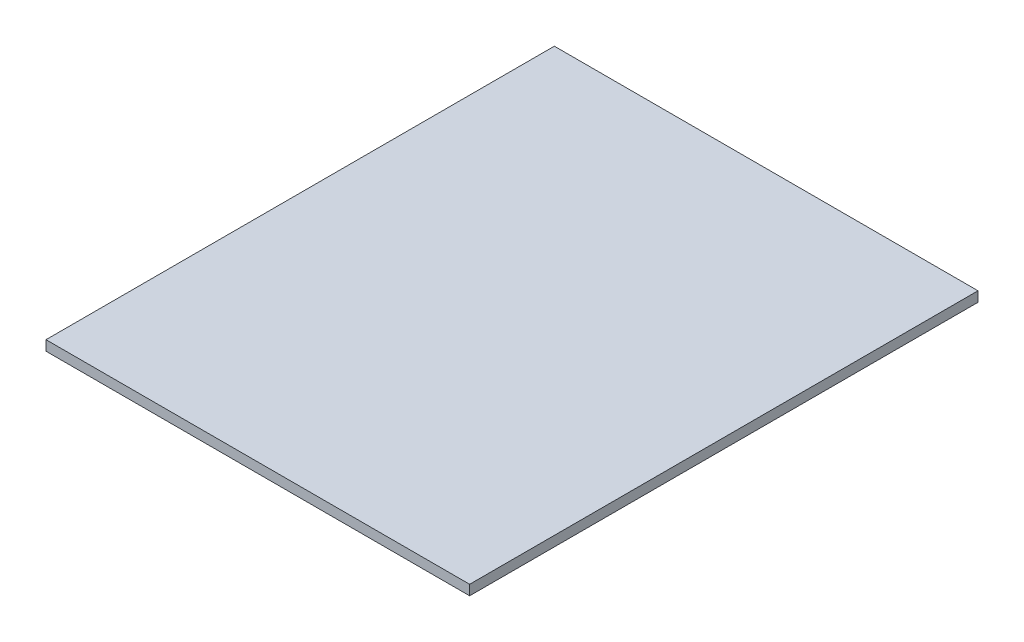
ISO-10303-21;
HEADER;
FILE_DESCRIPTION(('STEP AP214'),'2;1');
FILE_NAME('part.step','',(''),(''),'','','');
FILE_SCHEMA(('AUTOMOTIVE_DESIGN { 1 0 10303 214 1 1 1 1 }'));
ENDSEC;
DATA;
#1=APPLICATION_CONTEXT('core data for automotive mechanical design processes');
#2=APPLICATION_PROTOCOL_DEFINITION('international standard','automotive_design',2000,#1);
#3=PRODUCT_CONTEXT('',#1,'mechanical');
#4=PRODUCT('Part','Part','',(#3));
#5=PRODUCT_RELATED_PRODUCT_CATEGORY('part','',(#4));
#6=PRODUCT_DEFINITION_FORMATION('','',#4);
#7=PRODUCT_DEFINITION_CONTEXT('part definition',#1,'design');
#8=PRODUCT_DEFINITION('design','',#6,#7);
#9=PRODUCT_DEFINITION_SHAPE('','',#8);
#10=(LENGTH_UNIT() NAMED_UNIT(*) SI_UNIT(.MILLI.,.METRE.));
#11=(NAMED_UNIT(*) PLANE_ANGLE_UNIT() SI_UNIT($,.RADIAN.));
#12=(NAMED_UNIT(*) SI_UNIT($,.STERADIAN.) SOLID_ANGLE_UNIT());
#13=UNCERTAINTY_MEASURE_WITH_UNIT(LENGTH_MEASURE(1.E-05),#10,'distance_accuracy_value','');
#14=(GEOMETRIC_REPRESENTATION_CONTEXT(3) GLOBAL_UNCERTAINTY_ASSIGNED_CONTEXT((#13)) GLOBAL_UNIT_ASSIGNED_CONTEXT((#10,
#11,#12)) REPRESENTATION_CONTEXT('',''));
#15=CARTESIAN_POINT('',(0.,0.,0.));
#16=DIRECTION('',(0.,0.,1.));
#17=DIRECTION('',(1.,0.,0.));
#18=AXIS2_PLACEMENT_3D('',#15,#16,#17);
#19=CARTESIAN_POINT('',(63.5,3.,-76.2));
#20=DIRECTION('',(-1.,0.,0.));
#21=DIRECTION('',(0.,0.,1.));
#22=AXIS2_PLACEMENT_3D('',#19,#20,#21);
#23=PLANE('',#22);
#24=DIRECTION('',(0.,0.,-1.));
#25=VECTOR('',#24,1.);
#26=CARTESIAN_POINT('',(63.5,0.,-76.2));
#27=LINE('',#26,#25);
#28=CARTESIAN_POINT('',(63.5,0.,76.2));
#29=VERTEX_POINT('',#28);
#30=CARTESIAN_POINT('',(63.5,0.,-76.2));
#31=VERTEX_POINT('',#30);
#32=EDGE_CURVE('E102',#29,#31,#27,.T.);
#33=ORIENTED_EDGE('',*,*,#32,.T.);
#34=DIRECTION('',(0.,-1.,0.));
#35=VECTOR('',#34,1.);
#36=CARTESIAN_POINT('',(63.5,3.,-76.2));
#37=LINE('',#36,#35);
#38=CARTESIAN_POINT('',(63.5,3.,-76.2));
#39=VERTEX_POINT('',#38);
#40=EDGE_CURVE('E11',#39,#31,#37,.T.);
#41=ORIENTED_EDGE('',*,*,#40,.F.);
#42=DIRECTION('',(0.,0.,-1.));
#43=VECTOR('',#42,1.);
#44=CARTESIAN_POINT('',(63.5,3.,-76.2));
#45=LINE('',#44,#43);
#46=CARTESIAN_POINT('',(63.5,3.,76.2));
#47=VERTEX_POINT('',#46);
#48=EDGE_CURVE('E90',#47,#39,#45,.T.);
#49=ORIENTED_EDGE('',*,*,#48,.F.);
#50=DIRECTION('',(0.,-1.,0.));
#51=VECTOR('',#50,1.);
#52=CARTESIAN_POINT('',(63.5,3.,76.2));
#53=LINE('',#52,#51);
#54=EDGE_CURVE('E98',#47,#29,#53,.T.);
#55=ORIENTED_EDGE('',*,*,#54,.T.);
#56=EDGE_LOOP('',(#33,#41,#49,#55));
#57=FACE_BOUND('',#56,.T.);
#58=ADVANCED_FACE('F39',(#57),#23,.F.);
#59=CARTESIAN_POINT('',(-63.5,3.,-76.2));
#60=DIRECTION('',(0.,0.,1.));
#61=DIRECTION('',(1.,0.,0.));
#62=AXIS2_PLACEMENT_3D('',#59,#60,#61);
#63=PLANE('',#62);
#64=DIRECTION('',(-1.,0.,0.));
#65=VECTOR('',#64,1.);
#66=CARTESIAN_POINT('',(-63.5,0.,-76.2));
#67=LINE('',#66,#65);
#68=CARTESIAN_POINT('',(-63.5,0.,-76.2));
#69=VERTEX_POINT('',#68);
#70=EDGE_CURVE('E94',#31,#69,#67,.T.);
#71=ORIENTED_EDGE('',*,*,#70,.T.);
#72=DIRECTION('',(0.,-1.,0.));
#73=VECTOR('',#72,1.);
#74=CARTESIAN_POINT('',(-63.5,3.,-76.2));
#75=LINE('',#74,#73);
#76=CARTESIAN_POINT('',(-63.5,3.,-76.2));
#77=VERTEX_POINT('',#76);
#78=EDGE_CURVE('E47',#77,#69,#75,.T.);
#79=ORIENTED_EDGE('',*,*,#78,.F.);
#80=DIRECTION('',(-1.,0.,0.));
#81=VECTOR('',#80,1.);
#82=CARTESIAN_POINT('',(-63.5,3.,-76.2));
#83=LINE('',#82,#81);
#84=EDGE_CURVE('E85',#39,#77,#83,.T.);
#85=ORIENTED_EDGE('',*,*,#84,.F.);
#86=ORIENTED_EDGE('',*,*,#40,.T.);
#87=EDGE_LOOP('',(#71,#79,#85,#86));
#88=FACE_BOUND('',#87,.T.);
#89=ADVANCED_FACE('F93',(#88),#63,.F.);
#90=CARTESIAN_POINT('',(-63.5,3.,-76.2));
#91=DIRECTION('',(1.,0.,0.));
#92=DIRECTION('',(0.,0.,-1.));
#93=AXIS2_PLACEMENT_3D('',#90,#91,#92);
#94=PLANE('',#93);
#95=DIRECTION('',(0.,0.,1.));
#96=VECTOR('',#95,1.);
#97=CARTESIAN_POINT('',(-63.5,0.,-76.2));
#98=LINE('',#97,#96);
#99=CARTESIAN_POINT('',(-63.5,0.,76.2));
#100=VERTEX_POINT('',#99);
#101=EDGE_CURVE('E72',#69,#100,#98,.T.);
#102=ORIENTED_EDGE('',*,*,#101,.T.);
#103=DIRECTION('',(0.,-1.,0.));
#104=VECTOR('',#103,1.);
#105=CARTESIAN_POINT('',(-63.5,3.,76.2));
#106=LINE('',#105,#104);
#107=CARTESIAN_POINT('',(-63.5,3.,76.2));
#108=VERTEX_POINT('',#107);
#109=EDGE_CURVE('E95',#108,#100,#106,.T.);
#110=ORIENTED_EDGE('',*,*,#109,.F.);
#111=DIRECTION('',(0.,0.,1.));
#112=VECTOR('',#111,1.);
#113=CARTESIAN_POINT('',(-63.5,3.,-76.2));
#114=LINE('',#113,#112);
#115=EDGE_CURVE('E88',#77,#108,#114,.T.);
#116=ORIENTED_EDGE('',*,*,#115,.F.);
#117=ORIENTED_EDGE('',*,*,#78,.T.);
#118=EDGE_LOOP('',(#102,#110,#116,#117));
#119=FACE_BOUND('',#118,.T.);
#120=ADVANCED_FACE('F96',(#119),#94,.F.);
#121=CARTESIAN_POINT('',(-63.5,3.,76.2));
#122=DIRECTION('',(0.,0.,-1.));
#123=DIRECTION('',(-1.,0.,0.));
#124=AXIS2_PLACEMENT_3D('',#121,#122,#123);
#125=PLANE('',#124);
#126=DIRECTION('',(1.,0.,0.));
#127=VECTOR('',#126,1.);
#128=CARTESIAN_POINT('',(-63.5,0.,76.2));
#129=LINE('',#128,#127);
#130=EDGE_CURVE('E78',#100,#29,#129,.T.);
#131=ORIENTED_EDGE('',*,*,#130,.T.);
#132=ORIENTED_EDGE('',*,*,#54,.F.);
#133=DIRECTION('',(1.,0.,0.));
#134=VECTOR('',#133,1.);
#135=CARTESIAN_POINT('',(-63.5,3.,76.2));
#136=LINE('',#135,#134);
#137=EDGE_CURVE('E55',#108,#47,#136,.T.);
#138=ORIENTED_EDGE('',*,*,#137,.F.);
#139=ORIENTED_EDGE('',*,*,#109,.T.);
#140=EDGE_LOOP('',(#131,#132,#138,#139));
#141=FACE_BOUND('',#140,.T.);
#142=ADVANCED_FACE('F109',(#141),#125,.F.);
#143=CARTESIAN_POINT('',(0.,3.,0.));
#144=DIRECTION('',(0.,1.,0.));
#145=DIRECTION('',(0.,0.,1.));
#146=AXIS2_PLACEMENT_3D('',#143,#144,#145);
#147=PLANE('',#146);
#148=ORIENTED_EDGE('',*,*,#48,.T.);
#149=ORIENTED_EDGE('',*,*,#84,.T.);
#150=ORIENTED_EDGE('',*,*,#115,.T.);
#151=ORIENTED_EDGE('',*,*,#137,.T.);
#152=EDGE_LOOP('',(#148,#149,#150,#151));
#153=FACE_BOUND('',#152,.T.);
#154=ADVANCED_FACE('F86',(#153),#147,.T.);
#155=CARTESIAN_POINT('',(0.,0.,0.));
#156=DIRECTION('',(0.,1.,0.));
#157=DIRECTION('',(0.,0.,1.));
#158=AXIS2_PLACEMENT_3D('',#155,#156,#157);
#159=PLANE('',#158);
#160=ORIENTED_EDGE('',*,*,#32,.F.);
#161=ORIENTED_EDGE('',*,*,#130,.F.);
#162=ORIENTED_EDGE('',*,*,#101,.F.);
#163=ORIENTED_EDGE('',*,*,#70,.F.);
#164=EDGE_LOOP('',(#160,#161,#162,#163));
#165=FACE_BOUND('',#164,.T.);
#166=ADVANCED_FACE('F112',(#165),#159,.F.);
#167=CLOSED_SHELL('',(#58,#89,#120,#142,#154,#166));
#168=MANIFOLD_SOLID_BREP('B2',#167);
#169=ADVANCED_BREP_SHAPE_REPRESENTATION('',(#18,#168),#14);
#170=SHAPE_DEFINITION_REPRESENTATION(#9,#169);
ENDSEC;
END-ISO-10303-21;
